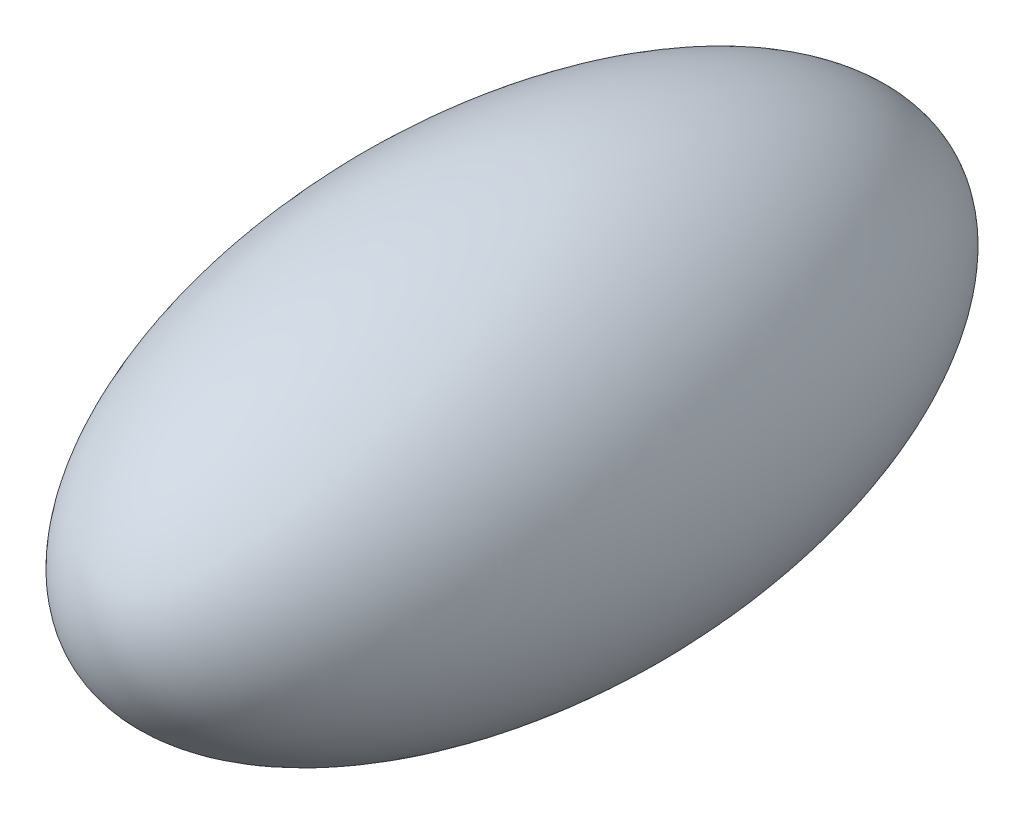
ISO-10303-21;
HEADER;
FILE_DESCRIPTION(('STEP AP214'),'2;1');
FILE_NAME('part.step','',(''),(''),'','','');
FILE_SCHEMA(('AUTOMOTIVE_DESIGN { 1 0 10303 214 1 1 1 1 }'));
ENDSEC;
DATA;
#1=APPLICATION_CONTEXT('core data for automotive mechanical design processes');
#2=APPLICATION_PROTOCOL_DEFINITION('international standard','automotive_design',2000,#1);
#3=PRODUCT_CONTEXT('',#1,'mechanical');
#4=PRODUCT('Part','Part','',(#3));
#5=PRODUCT_RELATED_PRODUCT_CATEGORY('part','',(#4));
#6=PRODUCT_DEFINITION_FORMATION('','',#4);
#7=PRODUCT_DEFINITION_CONTEXT('part definition',#1,'design');
#8=PRODUCT_DEFINITION('design','',#6,#7);
#9=PRODUCT_DEFINITION_SHAPE('','',#8);
#10=(LENGTH_UNIT() NAMED_UNIT(*) SI_UNIT(.MILLI.,.METRE.));
#11=(NAMED_UNIT(*) PLANE_ANGLE_UNIT() SI_UNIT($,.RADIAN.));
#12=(NAMED_UNIT(*) SI_UNIT($,.STERADIAN.) SOLID_ANGLE_UNIT());
#13=UNCERTAINTY_MEASURE_WITH_UNIT(LENGTH_MEASURE(1.E-05),#10,'distance_accuracy_value','');
#14=(GEOMETRIC_REPRESENTATION_CONTEXT(3) GLOBAL_UNCERTAINTY_ASSIGNED_CONTEXT((#13)) GLOBAL_UNIT_ASSIGNED_CONTEXT((#10,
#11,#12)) REPRESENTATION_CONTEXT('',''));
#15=CARTESIAN_POINT('',(0.,0.,0.));
#16=DIRECTION('',(0.,0.,1.));
#17=DIRECTION('',(1.,0.,0.));
#18=AXIS2_PLACEMENT_3D('',#15,#16,#17);
#19=CARTESIAN_POINT('',(0.,0.,0.));
#20=DIRECTION('',(0.,1.,0.));
#21=DIRECTION('',(0.,0.,-1.));
#22=AXIS2_PLACEMENT_3D('',#19,#20,#21);
#23=ELLIPSE('',#22,100.,50.);
#24=TRIMMED_CURVE('',#23,(PARAMETER_VALUE(3.14159265358979)),
(PARAMETER_VALUE(6.28318530717959)),.T.,.PARAMETER.);
#25=CARTESIAN_POINT('',(0.,0.,-100.));
#26=DIRECTION('',(0.,0.,1.));
#27=AXIS1_PLACEMENT('',#25,#26);
#28=SURFACE_OF_REVOLUTION('',#24,#27);
#29=CARTESIAN_POINT('',(0.,0.,-100.));
#30=VERTEX_POINT('',#29);
#31=VERTEX_LOOP('',#30);
#32=FACE_BOUND('',#31,.T.);
#33=CARTESIAN_POINT('',(0.,0.,100.));
#34=VERTEX_POINT('',#33);
#35=VERTEX_LOOP('',#34);
#36=FACE_BOUND('',#35,.T.);
#37=ADVANCED_FACE('F34',(#32,#36),#28,.F.);
#38=CLOSED_SHELL('',(#37));
#39=MANIFOLD_SOLID_BREP('B2',#38);
#40=ADVANCED_BREP_SHAPE_REPRESENTATION('',(#18,#39),#14);
#41=SHAPE_DEFINITION_REPRESENTATION(#9,#40);
ENDSEC;
END-ISO-10303-21;
